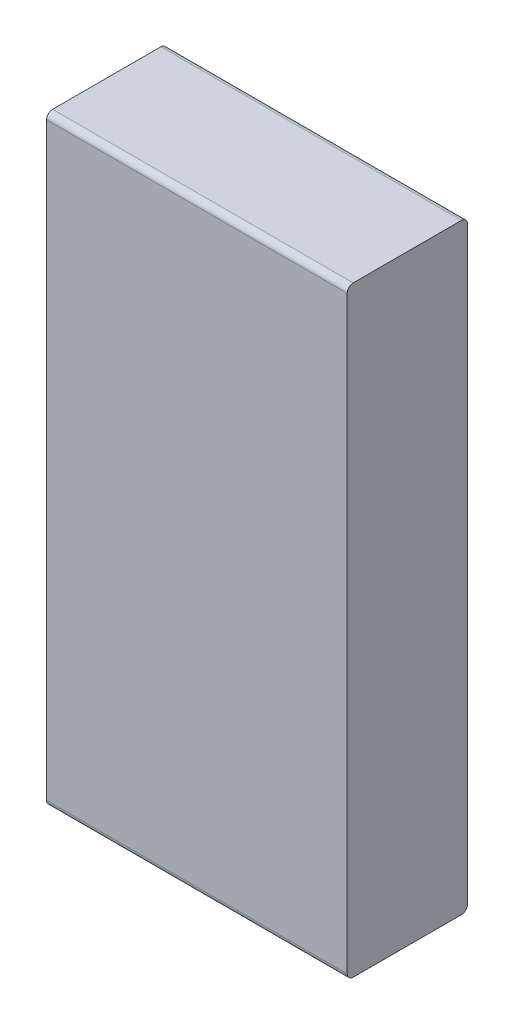
ISO-10303-21;
HEADER;
FILE_DESCRIPTION(('STEP AP214'),'2;1');
FILE_NAME('part.step','',(''),(''),'','','');
FILE_SCHEMA(('AUTOMOTIVE_DESIGN { 1 0 10303 214 1 1 1 1 }'));
ENDSEC;
DATA;
#1=APPLICATION_CONTEXT('core data for automotive mechanical design processes');
#2=APPLICATION_PROTOCOL_DEFINITION('international standard','automotive_design',2000,#1);
#3=PRODUCT_CONTEXT('',#1,'mechanical');
#4=PRODUCT('Part','Part','',(#3));
#5=PRODUCT_RELATED_PRODUCT_CATEGORY('part','',(#4));
#6=PRODUCT_DEFINITION_FORMATION('','',#4);
#7=PRODUCT_DEFINITION_CONTEXT('part definition',#1,'design');
#8=PRODUCT_DEFINITION('design','',#6,#7);
#9=PRODUCT_DEFINITION_SHAPE('','',#8);
#10=(LENGTH_UNIT() NAMED_UNIT(*) SI_UNIT(.MILLI.,.METRE.));
#11=(NAMED_UNIT(*) PLANE_ANGLE_UNIT() SI_UNIT($,.RADIAN.));
#12=(NAMED_UNIT(*) SI_UNIT($,.STERADIAN.) SOLID_ANGLE_UNIT());
#13=UNCERTAINTY_MEASURE_WITH_UNIT(LENGTH_MEASURE(1.E-05),#10,'distance_accuracy_value','');
#14=(GEOMETRIC_REPRESENTATION_CONTEXT(3) GLOBAL_UNCERTAINTY_ASSIGNED_CONTEXT((#13)) GLOBAL_UNIT_ASSIGNED_CONTEXT((#10,
#11,#12)) REPRESENTATION_CONTEXT('',''));
#15=CARTESIAN_POINT('',(0.,0.,0.));
#16=DIRECTION('',(0.,0.,1.));
#17=DIRECTION('',(1.,0.,0.));
#18=AXIS2_PLACEMENT_3D('',#15,#16,#17);
#19=CARTESIAN_POINT('',(0.25,-0.5,0.));
#20=DIRECTION('',(-1.,0.,0.));
#21=DIRECTION('',(0.,0.,1.));
#22=AXIS2_PLACEMENT_3D('',#19,#20,#21);
#23=PLANE('',#22);
#24=DIRECTION('',(0.,0.,1.));
#25=VECTOR('',#24,1.);
#26=CARTESIAN_POINT('',(0.25,-0.5,0.));
#27=LINE('',#26,#25);
#28=CARTESIAN_POINT('',(0.25,-0.5,0.01));
#29=VERTEX_POINT('',#28);
#30=CARTESIAN_POINT('',(0.25,-0.5,0.19));
#31=VERTEX_POINT('',#30);
#32=EDGE_CURVE('E11',#29,#31,#27,.T.);
#33=ORIENTED_EDGE('',*,*,#32,.F.);
#34=CARTESIAN_POINT('',(0.25,-0.49,0.01));
#35=DIRECTION('',(1.,0.,0.));
#36=DIRECTION('',(0.,0.,1.));
#37=AXIS2_PLACEMENT_3D('',#34,#35,#36);
#38=CIRCLE('',#37,0.01);
#39=CARTESIAN_POINT('',(0.25,-0.49,0.));
#40=VERTEX_POINT('',#39);
#41=EDGE_CURVE('E190',#29,#40,#38,.T.);
#42=ORIENTED_EDGE('',*,*,#41,.T.);
#43=DIRECTION('',(0.,1.,0.));
#44=VECTOR('',#43,1.);
#45=CARTESIAN_POINT('',(0.25,-0.5,0.));
#46=LINE('',#45,#44);
#47=CARTESIAN_POINT('',(0.25,0.49,0.));
#48=VERTEX_POINT('',#47);
#49=EDGE_CURVE('E136',#40,#48,#46,.T.);
#50=ORIENTED_EDGE('',*,*,#49,.T.);
#51=CARTESIAN_POINT('',(0.25,0.49,0.01));
#52=DIRECTION('',(-1.,0.,0.));
#53=DIRECTION('',(0.,0.,-1.));
#54=AXIS2_PLACEMENT_3D('',#51,#52,#53);
#55=CIRCLE('',#54,0.01);
#56=CARTESIAN_POINT('',(0.25,0.5,0.01));
#57=VERTEX_POINT('',#56);
#58=EDGE_CURVE('E166',#57,#48,#55,.T.);
#59=ORIENTED_EDGE('',*,*,#58,.F.);
#60=DIRECTION('',(0.,0.,1.));
#61=VECTOR('',#60,1.);
#62=CARTESIAN_POINT('',(0.25,0.5,0.));
#63=LINE('',#62,#61);
#64=CARTESIAN_POINT('',(0.25,0.5,0.19));
#65=VERTEX_POINT('',#64);
#66=EDGE_CURVE('E107',#57,#65,#63,.T.);
#67=ORIENTED_EDGE('',*,*,#66,.T.);
#68=CARTESIAN_POINT('',(0.25,0.49,0.19));
#69=DIRECTION('',(1.,0.,0.));
#70=DIRECTION('',(0.,0.,-1.));
#71=AXIS2_PLACEMENT_3D('',#68,#69,#70);
#72=CIRCLE('',#71,0.01);
#73=CARTESIAN_POINT('',(0.25,0.49,0.2));
#74=VERTEX_POINT('',#73);
#75=EDGE_CURVE('E137',#65,#74,#72,.T.);
#76=ORIENTED_EDGE('',*,*,#75,.T.);
#77=DIRECTION('',(0.,1.,0.));
#78=VECTOR('',#77,1.);
#79=CARTESIAN_POINT('',(0.25,-0.5,0.2));
#80=LINE('',#79,#78);
#81=CARTESIAN_POINT('',(0.25,-0.49,0.2));
#82=VERTEX_POINT('',#81);
#83=EDGE_CURVE('E187',#82,#74,#80,.T.);
#84=ORIENTED_EDGE('',*,*,#83,.F.);
#85=CARTESIAN_POINT('',(0.25,-0.49,0.19));
#86=DIRECTION('',(-1.,0.,0.));
#87=DIRECTION('',(0.,0.,1.));
#88=AXIS2_PLACEMENT_3D('',#85,#86,#87);
#89=CIRCLE('',#88,0.01);
#90=EDGE_CURVE('E25',#31,#82,#89,.T.);
#91=ORIENTED_EDGE('',*,*,#90,.F.);
#92=EDGE_LOOP('',(#33,#42,#50,#59,#67,#76,#84,#91));
#93=FACE_BOUND('',#92,.T.);
#94=ADVANCED_FACE('F17',(#93),#23,.F.);
#95=CARTESIAN_POINT('',(-0.25,-0.5,0.));
#96=DIRECTION('',(0.,1.,0.));
#97=DIRECTION('',(1.,0.,0.));
#98=AXIS2_PLACEMENT_3D('',#95,#96,#97);
#99=PLANE('',#98);
#100=DIRECTION('',(0.,0.,1.));
#101=VECTOR('',#100,1.);
#102=CARTESIAN_POINT('',(-0.25,-0.5,0.));
#103=LINE('',#102,#101);
#104=CARTESIAN_POINT('',(-0.25,-0.5,0.01));
#105=VERTEX_POINT('',#104);
#106=CARTESIAN_POINT('',(-0.25,-0.5,0.19));
#107=VERTEX_POINT('',#106);
#108=EDGE_CURVE('E144',#105,#107,#103,.T.);
#109=ORIENTED_EDGE('',*,*,#108,.F.);
#110=DIRECTION('',(1.,0.,0.));
#111=VECTOR('',#110,1.);
#112=CARTESIAN_POINT('',(-0.25,-0.5,0.01));
#113=LINE('',#112,#111);
#114=EDGE_CURVE('E153',#105,#29,#113,.T.);
#115=ORIENTED_EDGE('',*,*,#114,.T.);
#116=ORIENTED_EDGE('',*,*,#32,.T.);
#117=DIRECTION('',(1.,0.,0.));
#118=VECTOR('',#117,1.);
#119=CARTESIAN_POINT('',(-0.25,-0.5,0.19));
#120=LINE('',#119,#118);
#121=EDGE_CURVE('E149',#107,#31,#120,.T.);
#122=ORIENTED_EDGE('',*,*,#121,.F.);
#123=EDGE_LOOP('',(#109,#115,#116,#122));
#124=FACE_BOUND('',#123,.T.);
#125=ADVANCED_FACE('F196',(#124),#99,.F.);
#126=CARTESIAN_POINT('',(-0.25,-0.49,0.19));
#127=DIRECTION('',(1.,0.,0.));
#128=DIRECTION('',(0.,-1.,0.));
#129=AXIS2_PLACEMENT_3D('',#126,#127,#128);
#130=CYLINDRICAL_SURFACE('',#129,0.01);
#131=CARTESIAN_POINT('',(-0.25,-0.49,0.19));
#132=DIRECTION('',(-1.,0.,0.));
#133=DIRECTION('',(0.,0.,1.));
#134=AXIS2_PLACEMENT_3D('',#131,#132,#133);
#135=CIRCLE('',#134,0.01);
#136=CARTESIAN_POINT('',(-0.25,-0.49,0.2));
#137=VERTEX_POINT('',#136);
#138=EDGE_CURVE('E148',#107,#137,#135,.T.);
#139=ORIENTED_EDGE('',*,*,#138,.F.);
#140=ORIENTED_EDGE('',*,*,#121,.T.);
#141=ORIENTED_EDGE('',*,*,#90,.T.);
#142=DIRECTION('',(1.,0.,0.));
#143=VECTOR('',#142,1.);
#144=CARTESIAN_POINT('',(-0.25,-0.49,0.2));
#145=LINE('',#144,#143);
#146=EDGE_CURVE('E183',#137,#82,#145,.T.);
#147=ORIENTED_EDGE('',*,*,#146,.F.);
#148=EDGE_LOOP('',(#139,#140,#141,#147));
#149=FACE_BOUND('',#148,.T.);
#150=ADVANCED_FACE('F205',(#149),#130,.T.);
#151=CARTESIAN_POINT('',(-0.25,-0.49,0.01));
#152=DIRECTION('',(1.,0.,0.));
#153=DIRECTION('',(0.,-1.,0.));
#154=AXIS2_PLACEMENT_3D('',#151,#152,#153);
#155=CYLINDRICAL_SURFACE('',#154,0.01);
#156=CARTESIAN_POINT('',(-0.25,-0.49,0.01));
#157=DIRECTION('',(1.,0.,0.));
#158=DIRECTION('',(0.,0.,1.));
#159=AXIS2_PLACEMENT_3D('',#156,#157,#158);
#160=CIRCLE('',#159,0.01);
#161=CARTESIAN_POINT('',(-0.25,-0.49,0.));
#162=VERTEX_POINT('',#161);
#163=EDGE_CURVE('E140',#105,#162,#160,.T.);
#164=ORIENTED_EDGE('',*,*,#163,.T.);
#165=DIRECTION('',(1.,0.,0.));
#166=VECTOR('',#165,1.);
#167=CARTESIAN_POINT('',(-0.25,-0.49,0.));
#168=LINE('',#167,#166);
#169=EDGE_CURVE('E165',#162,#40,#168,.T.);
#170=ORIENTED_EDGE('',*,*,#169,.T.);
#171=ORIENTED_EDGE('',*,*,#41,.F.);
#172=ORIENTED_EDGE('',*,*,#114,.F.);
#173=EDGE_LOOP('',(#164,#170,#171,#172));
#174=FACE_BOUND('',#173,.T.);
#175=ADVANCED_FACE('F199',(#174),#155,.T.);
#176=CARTESIAN_POINT('',(0.,0.,0.2));
#177=DIRECTION('',(0.,0.,1.));
#178=DIRECTION('',(1.,0.,0.));
#179=AXIS2_PLACEMENT_3D('',#176,#177,#178);
#180=PLANE('',#179);
#181=DIRECTION('',(0.,-1.,0.));
#182=VECTOR('',#181,1.);
#183=CARTESIAN_POINT('',(-0.25,0.5,0.2));
#184=LINE('',#183,#182);
#185=CARTESIAN_POINT('',(-0.25,0.49,0.2));
#186=VERTEX_POINT('',#185);
#187=EDGE_CURVE('E157',#186,#137,#184,.T.);
#188=ORIENTED_EDGE('',*,*,#187,.T.);
#189=ORIENTED_EDGE('',*,*,#146,.T.);
#190=ORIENTED_EDGE('',*,*,#83,.T.);
#191=DIRECTION('',(-1.,0.,0.));
#192=VECTOR('',#191,1.);
#193=CARTESIAN_POINT('',(0.25,0.49,0.2));
#194=LINE('',#193,#192);
#195=EDGE_CURVE('E133',#74,#186,#194,.T.);
#196=ORIENTED_EDGE('',*,*,#195,.T.);
#197=EDGE_LOOP('',(#188,#189,#190,#196));
#198=FACE_BOUND('',#197,.T.);
#199=ADVANCED_FACE('F208',(#198),#180,.T.);
#200=CARTESIAN_POINT('',(0.,0.,0.));
#201=DIRECTION('',(0.,0.,1.));
#202=DIRECTION('',(1.,0.,0.));
#203=AXIS2_PLACEMENT_3D('',#200,#201,#202);
#204=PLANE('',#203);
#205=DIRECTION('',(0.,-1.,0.));
#206=VECTOR('',#205,1.);
#207=CARTESIAN_POINT('',(-0.25,0.5,0.));
#208=LINE('',#207,#206);
#209=CARTESIAN_POINT('',(-0.25,0.49,0.));
#210=VERTEX_POINT('',#209);
#211=EDGE_CURVE('E122',#210,#162,#208,.T.);
#212=ORIENTED_EDGE('',*,*,#211,.F.);
#213=DIRECTION('',(-1.,0.,0.));
#214=VECTOR('',#213,1.);
#215=CARTESIAN_POINT('',(0.25,0.49,0.));
#216=LINE('',#215,#214);
#217=EDGE_CURVE('E117',#48,#210,#216,.T.);
#218=ORIENTED_EDGE('',*,*,#217,.F.);
#219=ORIENTED_EDGE('',*,*,#49,.F.);
#220=ORIENTED_EDGE('',*,*,#169,.F.);
#221=EDGE_LOOP('',(#212,#218,#219,#220));
#222=FACE_BOUND('',#221,.T.);
#223=ADVANCED_FACE('F202',(#222),#204,.F.);
#224=CARTESIAN_POINT('',(0.25,0.49,0.19));
#225=DIRECTION('',(-1.,0.,0.));
#226=DIRECTION('',(0.,1.,0.));
#227=AXIS2_PLACEMENT_3D('',#224,#225,#226);
#228=CYLINDRICAL_SURFACE('',#227,0.01);
#229=ORIENTED_EDGE('',*,*,#75,.F.);
#230=DIRECTION('',(-1.,0.,0.));
#231=VECTOR('',#230,1.);
#232=CARTESIAN_POINT('',(0.25,0.5,0.19));
#233=LINE('',#232,#231);
#234=CARTESIAN_POINT('',(-0.25,0.5,0.19));
#235=VERTEX_POINT('',#234);
#236=EDGE_CURVE('E111',#65,#235,#233,.T.);
#237=ORIENTED_EDGE('',*,*,#236,.T.);
#238=CARTESIAN_POINT('',(-0.25,0.49,0.19));
#239=DIRECTION('',(1.,0.,0.));
#240=DIRECTION('',(0.,0.,-1.));
#241=AXIS2_PLACEMENT_3D('',#238,#239,#240);
#242=CIRCLE('',#241,0.01);
#243=EDGE_CURVE('E128',#235,#186,#242,.T.);
#244=ORIENTED_EDGE('',*,*,#243,.T.);
#245=ORIENTED_EDGE('',*,*,#195,.F.);
#246=EDGE_LOOP('',(#229,#237,#244,#245));
#247=FACE_BOUND('',#246,.T.);
#248=ADVANCED_FACE('F211',(#247),#228,.T.);
#249=CARTESIAN_POINT('',(0.25,0.49,0.01));
#250=DIRECTION('',(-1.,0.,0.));
#251=DIRECTION('',(0.,1.,0.));
#252=AXIS2_PLACEMENT_3D('',#249,#250,#251);
#253=CYLINDRICAL_SURFACE('',#252,0.01);
#254=ORIENTED_EDGE('',*,*,#58,.T.);
#255=ORIENTED_EDGE('',*,*,#217,.T.);
#256=CARTESIAN_POINT('',(-0.25,0.49,0.01));
#257=DIRECTION('',(-1.,0.,0.));
#258=DIRECTION('',(0.,0.,-1.));
#259=AXIS2_PLACEMENT_3D('',#256,#257,#258);
#260=CIRCLE('',#259,0.01);
#261=CARTESIAN_POINT('',(-0.25,0.5,0.01));
#262=VERTEX_POINT('',#261);
#263=EDGE_CURVE('E114',#262,#210,#260,.T.);
#264=ORIENTED_EDGE('',*,*,#263,.F.);
#265=DIRECTION('',(-1.,0.,0.));
#266=VECTOR('',#265,1.);
#267=CARTESIAN_POINT('',(0.25,0.5,0.01));
#268=LINE('',#267,#266);
#269=EDGE_CURVE('E100',#57,#262,#268,.T.);
#270=ORIENTED_EDGE('',*,*,#269,.F.);
#271=EDGE_LOOP('',(#254,#255,#264,#270));
#272=FACE_BOUND('',#271,.T.);
#273=ADVANCED_FACE('F115',(#272),#253,.T.);
#274=CARTESIAN_POINT('',(0.25,0.5,0.));
#275=DIRECTION('',(0.,-1.,0.));
#276=DIRECTION('',(0.,0.,-1.));
#277=AXIS2_PLACEMENT_3D('',#274,#275,#276);
#278=PLANE('',#277);
#279=ORIENTED_EDGE('',*,*,#66,.F.);
#280=ORIENTED_EDGE('',*,*,#269,.T.);
#281=DIRECTION('',(0.,0.,1.));
#282=VECTOR('',#281,1.);
#283=CARTESIAN_POINT('',(-0.25,0.5,0.));
#284=LINE('',#283,#282);
#285=EDGE_CURVE('E105',#262,#235,#284,.T.);
#286=ORIENTED_EDGE('',*,*,#285,.T.);
#287=ORIENTED_EDGE('',*,*,#236,.F.);
#288=EDGE_LOOP('',(#279,#280,#286,#287));
#289=FACE_BOUND('',#288,.T.);
#290=ADVANCED_FACE('F102',(#289),#278,.F.);
#291=CARTESIAN_POINT('',(-0.25,0.5,0.));
#292=DIRECTION('',(1.,0.,0.));
#293=DIRECTION('',(0.,1.,0.));
#294=AXIS2_PLACEMENT_3D('',#291,#292,#293);
#295=PLANE('',#294);
#296=ORIENTED_EDGE('',*,*,#285,.F.);
#297=ORIENTED_EDGE('',*,*,#263,.T.);
#298=ORIENTED_EDGE('',*,*,#211,.T.);
#299=ORIENTED_EDGE('',*,*,#163,.F.);
#300=ORIENTED_EDGE('',*,*,#108,.T.);
#301=ORIENTED_EDGE('',*,*,#138,.T.);
#302=ORIENTED_EDGE('',*,*,#187,.F.);
#303=ORIENTED_EDGE('',*,*,#243,.F.);
#304=EDGE_LOOP('',(#296,#297,#298,#299,#300,#301,#302,#303));
#305=FACE_BOUND('',#304,.T.);
#306=ADVANCED_FACE('F125',(#305),#295,.F.);
#307=CLOSED_SHELL('',(#94,#125,#150,#175,#199,#223,#248,#273,#290,#306));
#308=MANIFOLD_SOLID_BREP('B1',#307);
#309=ADVANCED_BREP_SHAPE_REPRESENTATION('',(#18,#308),#14);
#310=SHAPE_DEFINITION_REPRESENTATION(#9,#309);
ENDSEC;
END-ISO-10303-21;
